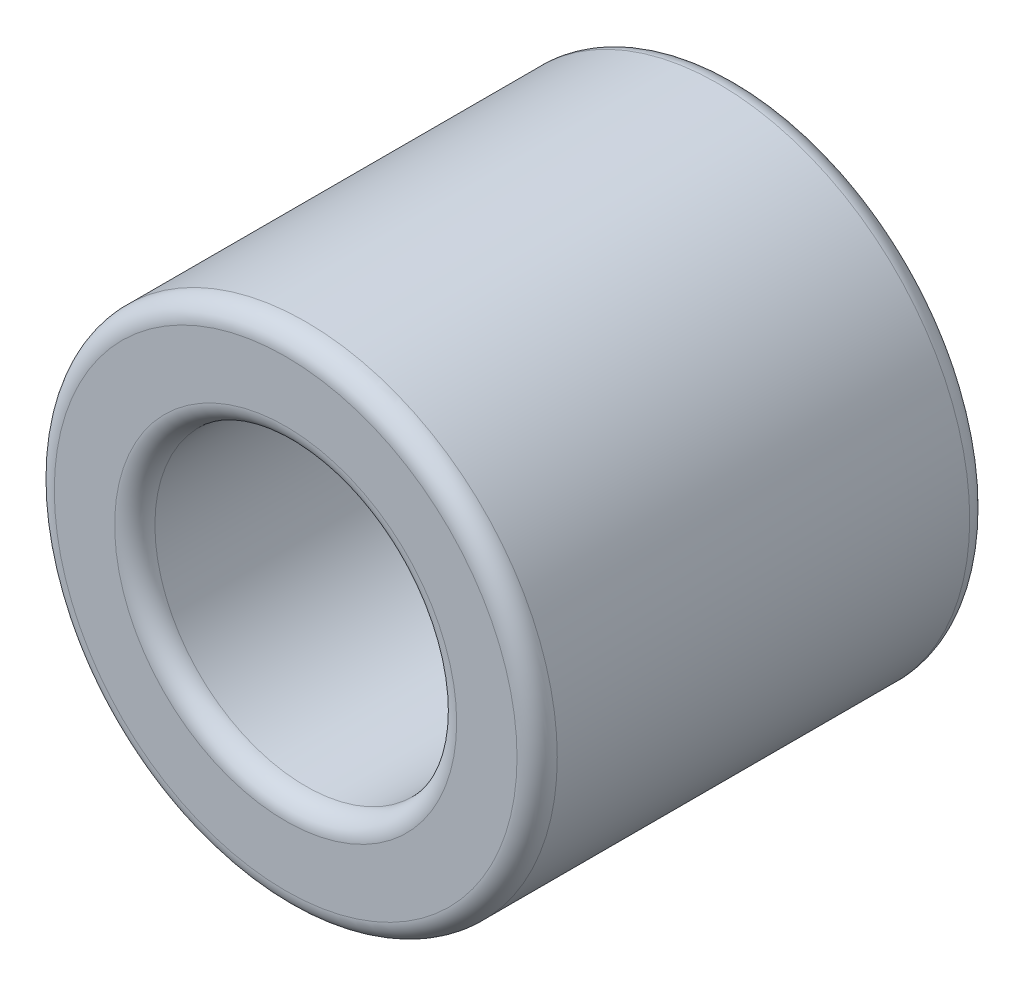
ISO-10303-21;
HEADER;
FILE_DESCRIPTION(('STEP AP214'),'2;1');
FILE_NAME('part.step','',(''),(''),'','','');
FILE_SCHEMA(('AUTOMOTIVE_DESIGN { 1 0 10303 214 1 1 1 1 }'));
ENDSEC;
DATA;
#1=APPLICATION_CONTEXT('core data for automotive mechanical design processes');
#2=APPLICATION_PROTOCOL_DEFINITION('international standard','automotive_design',2000,#1);
#3=PRODUCT_CONTEXT('',#1,'mechanical');
#4=PRODUCT('Part','Part','',(#3));
#5=PRODUCT_RELATED_PRODUCT_CATEGORY('part','',(#4));
#6=PRODUCT_DEFINITION_FORMATION('','',#4);
#7=PRODUCT_DEFINITION_CONTEXT('part definition',#1,'design');
#8=PRODUCT_DEFINITION('design','',#6,#7);
#9=PRODUCT_DEFINITION_SHAPE('','',#8);
#10=(LENGTH_UNIT() NAMED_UNIT(*) SI_UNIT(.MILLI.,.METRE.));
#11=(NAMED_UNIT(*) PLANE_ANGLE_UNIT() SI_UNIT($,.RADIAN.));
#12=(NAMED_UNIT(*) SI_UNIT($,.STERADIAN.) SOLID_ANGLE_UNIT());
#13=UNCERTAINTY_MEASURE_WITH_UNIT(LENGTH_MEASURE(1.E-05),#10,'distance_accuracy_value','');
#14=(GEOMETRIC_REPRESENTATION_CONTEXT(3) GLOBAL_UNCERTAINTY_ASSIGNED_CONTEXT((#13)) GLOBAL_UNIT_ASSIGNED_CONTEXT((#10,
#11,#12)) REPRESENTATION_CONTEXT('',''));
#15=CARTESIAN_POINT('',(0.,0.,0.));
#16=DIRECTION('',(0.,0.,1.));
#17=DIRECTION('',(1.,0.,0.));
#18=AXIS2_PLACEMENT_3D('',#15,#16,#17);
#19=CARTESIAN_POINT('',(0.,0.,9.));
#20=DIRECTION('',(0.,0.,-1.));
#21=DIRECTION('',(-1.,0.,0.));
#22=AXIS2_PLACEMENT_3D('',#19,#20,#21);
#23=CYLINDRICAL_SURFACE('',#22,3.);
#24=CARTESIAN_POINT('',(0.,0.,8.6));
#25=DIRECTION('',(0.,0.,1.));
#26=DIRECTION('',(1.,0.,0.));
#27=AXIS2_PLACEMENT_3D('',#24,#25,#26);
#28=CIRCLE('',#27,3.);
#29=CARTESIAN_POINT('',(3.,0.,8.6));
#30=VERTEX_POINT('',#29);
#31=EDGE_CURVE('E108',#30,#30,#28,.F.);
#32=ORIENTED_EDGE('',*,*,#31,.F.);
#33=EDGE_LOOP('',(#32));
#34=FACE_BOUND('',#33,.T.);
#35=CARTESIAN_POINT('',(0.,0.,0.399999999999999));
#36=DIRECTION('',(0.,0.,-1.));
#37=DIRECTION('',(-1.,0.,0.));
#38=AXIS2_PLACEMENT_3D('',#35,#36,#37);
#39=CIRCLE('',#38,3.);
#40=CARTESIAN_POINT('',(-3.,0.,0.399999999999999));
#41=VERTEX_POINT('',#40);
#42=EDGE_CURVE('E112',#41,#41,#39,.F.);
#43=ORIENTED_EDGE('',*,*,#42,.F.);
#44=EDGE_LOOP('',(#43));
#45=FACE_BOUND('',#44,.T.);
#46=ADVANCED_FACE('F15',(#34,#45),#23,.F.);
#47=CARTESIAN_POINT('',(0.,0.,0.399999999999999));
#48=DIRECTION('',(0.,0.,-1.));
#49=DIRECTION('',(-1.,0.,0.));
#50=AXIS2_PLACEMENT_3D('',#47,#48,#49);
#51=TOROIDAL_SURFACE('',#50,3.4,0.4);
#52=ORIENTED_EDGE('',*,*,#42,.T.);
#53=EDGE_LOOP('',(#52));
#54=FACE_BOUND('',#53,.T.);
#55=CARTESIAN_POINT('',(0.,0.,0.));
#56=DIRECTION('',(0.,0.,-1.));
#57=DIRECTION('',(-1.,0.,0.));
#58=AXIS2_PLACEMENT_3D('',#55,#56,#57);
#59=CIRCLE('',#58,3.4);
#60=CARTESIAN_POINT('',(-3.4,0.,0.));
#61=VERTEX_POINT('',#60);
#62=EDGE_CURVE('E111',#61,#61,#59,.F.);
#63=ORIENTED_EDGE('',*,*,#62,.F.);
#64=EDGE_LOOP('',(#63));
#65=FACE_BOUND('',#64,.T.);
#66=ADVANCED_FACE('F131',(#54,#65),#51,.T.);
#67=CARTESIAN_POINT('',(0.,0.,8.6));
#68=DIRECTION('',(0.,0.,1.));
#69=DIRECTION('',(1.,0.,0.));
#70=AXIS2_PLACEMENT_3D('',#67,#68,#69);
#71=TOROIDAL_SURFACE('',#70,3.4,0.4);
#72=CARTESIAN_POINT('',(0.,0.,9.));
#73=DIRECTION('',(0.,0.,1.));
#74=DIRECTION('',(1.,0.,0.));
#75=AXIS2_PLACEMENT_3D('',#72,#73,#74);
#76=CIRCLE('',#75,3.4);
#77=CARTESIAN_POINT('',(3.4,0.,9.));
#78=VERTEX_POINT('',#77);
#79=EDGE_CURVE('E119',#78,#78,#76,.F.);
#80=ORIENTED_EDGE('',*,*,#79,.F.);
#81=EDGE_LOOP('',(#80));
#82=FACE_BOUND('',#81,.T.);
#83=ORIENTED_EDGE('',*,*,#31,.T.);
#84=EDGE_LOOP('',(#83));
#85=FACE_BOUND('',#84,.T.);
#86=ADVANCED_FACE('F83',(#82,#85),#71,.T.);
#87=CARTESIAN_POINT('',(0.,0.,0.));
#88=DIRECTION('',(0.,0.,-1.));
#89=DIRECTION('',(-1.,0.,0.));
#90=AXIS2_PLACEMENT_3D('',#87,#88,#89);
#91=PLANE('',#90);
#92=ORIENTED_EDGE('',*,*,#62,.T.);
#93=EDGE_LOOP('',(#92));
#94=FACE_BOUND('',#93,.T.);
#95=CARTESIAN_POINT('',(0.,0.,0.));
#96=DIRECTION('',(0.,0.,1.));
#97=DIRECTION('',(-1.,0.,0.));
#98=AXIS2_PLACEMENT_3D('',#95,#96,#97);
#99=CIRCLE('',#98,4.6);
#100=CARTESIAN_POINT('',(-4.6,0.,0.));
#101=VERTEX_POINT('',#100);
#102=EDGE_CURVE('E66',#101,#101,#99,.T.);
#103=ORIENTED_EDGE('',*,*,#102,.F.);
#104=EDGE_LOOP('',(#103));
#105=FACE_BOUND('',#104,.T.);
#106=ADVANCED_FACE('F73',(#94,#105),#91,.T.);
#107=CARTESIAN_POINT('',(0.,0.,9.));
#108=DIRECTION('',(0.,0.,1.));
#109=DIRECTION('',(1.,0.,0.));
#110=AXIS2_PLACEMENT_3D('',#107,#108,#109);
#111=PLANE('',#110);
#112=ORIENTED_EDGE('',*,*,#79,.T.);
#113=EDGE_LOOP('',(#112));
#114=FACE_BOUND('',#113,.T.);
#115=CARTESIAN_POINT('',(0.,0.,9.));
#116=DIRECTION('',(0.,0.,-1.));
#117=DIRECTION('',(1.,0.,0.));
#118=AXIS2_PLACEMENT_3D('',#115,#116,#117);
#119=CIRCLE('',#118,4.6);
#120=CARTESIAN_POINT('',(4.6,0.,9.));
#121=VERTEX_POINT('',#120);
#122=EDGE_CURVE('E28',#121,#121,#119,.T.);
#123=ORIENTED_EDGE('',*,*,#122,.F.);
#124=EDGE_LOOP('',(#123));
#125=FACE_BOUND('',#124,.T.);
#126=ADVANCED_FACE('F82',(#114,#125),#111,.T.);
#127=CARTESIAN_POINT('',(0.,0.,0.4));
#128=DIRECTION('',(0.,0.,-1.));
#129=DIRECTION('',(-1.,0.,0.));
#130=AXIS2_PLACEMENT_3D('',#127,#128,#129);
#131=TOROIDAL_SURFACE('',#130,4.6,0.4);
#132=CARTESIAN_POINT('',(0.,0.,0.4));
#133=DIRECTION('',(0.,0.,1.));
#134=DIRECTION('',(1.,0.,0.));
#135=AXIS2_PLACEMENT_3D('',#132,#133,#134);
#136=CIRCLE('',#135,5.);
#137=CARTESIAN_POINT('',(5.,0.,0.4));
#138=VERTEX_POINT('',#137);
#139=EDGE_CURVE('E23',#138,#138,#136,.T.);
#140=ORIENTED_EDGE('',*,*,#139,.F.);
#141=EDGE_LOOP('',(#140));
#142=FACE_BOUND('',#141,.T.);
#143=ORIENTED_EDGE('',*,*,#102,.T.);
#144=EDGE_LOOP('',(#143));
#145=FACE_BOUND('',#144,.T.);
#146=ADVANCED_FACE('F46',(#142,#145),#131,.T.);
#147=CARTESIAN_POINT('',(0.,0.,8.6));
#148=DIRECTION('',(0.,0.,1.));
#149=DIRECTION('',(1.,0.,0.));
#150=AXIS2_PLACEMENT_3D('',#147,#148,#149);
#151=TOROIDAL_SURFACE('',#150,4.6,0.4);
#152=CARTESIAN_POINT('',(0.,0.,8.6));
#153=DIRECTION('',(0.,0.,1.));
#154=DIRECTION('',(1.,0.,0.));
#155=AXIS2_PLACEMENT_3D('',#152,#153,#154);
#156=CIRCLE('',#155,5.);
#157=CARTESIAN_POINT('',(5.,0.,8.6));
#158=VERTEX_POINT('',#157);
#159=EDGE_CURVE('E10',#158,#158,#156,.F.);
#160=ORIENTED_EDGE('',*,*,#159,.F.);
#161=EDGE_LOOP('',(#160));
#162=FACE_BOUND('',#161,.T.);
#163=ORIENTED_EDGE('',*,*,#122,.T.);
#164=EDGE_LOOP('',(#163));
#165=FACE_BOUND('',#164,.T.);
#166=ADVANCED_FACE('F40',(#162,#165),#151,.T.);
#167=CARTESIAN_POINT('',(0.,0.,0.));
#168=DIRECTION('',(0.,0.,1.));
#169=DIRECTION('',(1.,0.,0.));
#170=AXIS2_PLACEMENT_3D('',#167,#168,#169);
#171=CYLINDRICAL_SURFACE('',#170,5.);
#172=ORIENTED_EDGE('',*,*,#159,.T.);
#173=EDGE_LOOP('',(#172));
#174=FACE_BOUND('',#173,.T.);
#175=ORIENTED_EDGE('',*,*,#139,.T.);
#176=EDGE_LOOP('',(#175));
#177=FACE_BOUND('',#176,.T.);
#178=ADVANCED_FACE('F45',(#174,#177),#171,.T.);
#179=CLOSED_SHELL('',(#46,#66,#86,#106,#126,#146,#166,#178));
#180=MANIFOLD_SOLID_BREP('B1',#179);
#181=ADVANCED_BREP_SHAPE_REPRESENTATION('',(#18,#180),#14);
#182=SHAPE_DEFINITION_REPRESENTATION(#9,#181);
ENDSEC;
END-ISO-10303-21;
